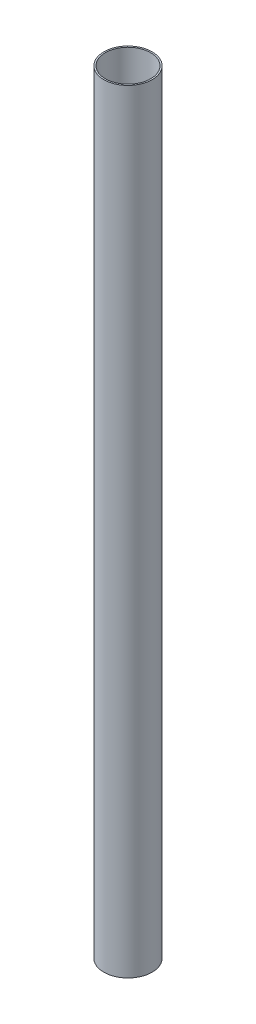
ISO-10303-21;
HEADER;
FILE_DESCRIPTION(('STEP AP214'),'2;1');
FILE_NAME('part.step','',(''),(''),'','','');
FILE_SCHEMA(('AUTOMOTIVE_DESIGN { 1 0 10303 214 1 1 1 1 }'));
ENDSEC;
DATA;
#1=APPLICATION_CONTEXT('core data for automotive mechanical design processes');
#2=APPLICATION_PROTOCOL_DEFINITION('international standard','automotive_design',2000,#1);
#3=PRODUCT_CONTEXT('',#1,'mechanical');
#4=PRODUCT('Part','Part','',(#3));
#5=PRODUCT_RELATED_PRODUCT_CATEGORY('part','',(#4));
#6=PRODUCT_DEFINITION_FORMATION('','',#4);
#7=PRODUCT_DEFINITION_CONTEXT('part definition',#1,'design');
#8=PRODUCT_DEFINITION('design','',#6,#7);
#9=PRODUCT_DEFINITION_SHAPE('','',#8);
#10=(LENGTH_UNIT() NAMED_UNIT(*) SI_UNIT(.MILLI.,.METRE.));
#11=(NAMED_UNIT(*) PLANE_ANGLE_UNIT() SI_UNIT($,.RADIAN.));
#12=(NAMED_UNIT(*) SI_UNIT($,.STERADIAN.) SOLID_ANGLE_UNIT());
#13=UNCERTAINTY_MEASURE_WITH_UNIT(LENGTH_MEASURE(1.E-05),#10,'distance_accuracy_value','');
#14=(GEOMETRIC_REPRESENTATION_CONTEXT(3) GLOBAL_UNCERTAINTY_ASSIGNED_CONTEXT((#13)) GLOBAL_UNIT_ASSIGNED_CONTEXT((#10,
#11,#12)) REPRESENTATION_CONTEXT('',''));
#15=CARTESIAN_POINT('',(0.,0.,0.));
#16=DIRECTION('',(0.,0.,1.));
#17=DIRECTION('',(1.,0.,0.));
#18=AXIS2_PLACEMENT_3D('',#15,#16,#17);
#19=CARTESIAN_POINT('',(0.,406.4,0.));
#20=DIRECTION('',(0.,-1.,0.));
#21=DIRECTION('',(0.,0.,-1.));
#22=AXIS2_PLACEMENT_3D('',#19,#20,#21);
#23=CYLINDRICAL_SURFACE('',#22,25.4);
#24=CARTESIAN_POINT('',(0.,406.4,0.));
#25=DIRECTION('',(0.,1.,0.));
#26=DIRECTION('',(0.,0.,1.));
#27=AXIS2_PLACEMENT_3D('',#24,#25,#26);
#28=CIRCLE('',#27,25.4);
#29=CARTESIAN_POINT('',(0.,406.4,25.4));
#30=VERTEX_POINT('',#29);
#31=EDGE_CURVE('E10',#30,#30,#28,.T.);
#32=ORIENTED_EDGE('',*,*,#31,.F.);
#33=EDGE_LOOP('',(#32));
#34=FACE_BOUND('',#33,.T.);
#35=CARTESIAN_POINT('',(0.,-406.4,0.));
#36=DIRECTION('',(0.,1.,0.));
#37=DIRECTION('',(0.,0.,1.));
#38=AXIS2_PLACEMENT_3D('',#35,#36,#37);
#39=CIRCLE('',#38,25.4);
#40=CARTESIAN_POINT('',(0.,-406.4,25.4));
#41=VERTEX_POINT('',#40);
#42=EDGE_CURVE('E40',#41,#41,#39,.T.);
#43=ORIENTED_EDGE('',*,*,#42,.T.);
#44=EDGE_LOOP('',(#43));
#45=FACE_BOUND('',#44,.T.);
#46=ADVANCED_FACE('F37',(#34,#45),#23,.T.);
#47=CARTESIAN_POINT('',(0.,406.4,0.));
#48=DIRECTION('',(0.,1.,0.));
#49=DIRECTION('',(0.,0.,1.));
#50=AXIS2_PLACEMENT_3D('',#47,#48,#49);
#51=PLANE('',#50);
#52=CARTESIAN_POINT('',(0.,406.4,0.));
#53=DIRECTION('',(0.,1.,0.));
#54=DIRECTION('',(0.,0.,1.));
#55=AXIS2_PLACEMENT_3D('',#52,#53,#54);
#56=CIRCLE('',#55,23.8125);
#57=CARTESIAN_POINT('',(0.,406.4,23.8125));
#58=VERTEX_POINT('',#57);
#59=EDGE_CURVE('E47',#58,#58,#56,.T.);
#60=ORIENTED_EDGE('',*,*,#59,.F.);
#61=EDGE_LOOP('',(#60));
#62=FACE_BOUND('',#61,.T.);
#63=ORIENTED_EDGE('',*,*,#31,.T.);
#64=EDGE_LOOP('',(#63));
#65=FACE_BOUND('',#64,.T.);
#66=ADVANCED_FACE('F58',(#62,#65),#51,.T.);
#67=CARTESIAN_POINT('',(0.,-406.4,0.));
#68=DIRECTION('',(0.,1.,0.));
#69=DIRECTION('',(0.,0.,1.));
#70=AXIS2_PLACEMENT_3D('',#67,#68,#69);
#71=PLANE('',#70);
#72=CARTESIAN_POINT('',(0.,-406.4,0.));
#73=DIRECTION('',(0.,1.,0.));
#74=DIRECTION('',(0.,0.,1.));
#75=AXIS2_PLACEMENT_3D('',#72,#73,#74);
#76=CIRCLE('',#75,23.8125);
#77=CARTESIAN_POINT('',(0.,-406.4,23.8125));
#78=VERTEX_POINT('',#77);
#79=EDGE_CURVE('E49',#78,#78,#76,.T.);
#80=ORIENTED_EDGE('',*,*,#79,.T.);
#81=EDGE_LOOP('',(#80));
#82=FACE_BOUND('',#81,.T.);
#83=ORIENTED_EDGE('',*,*,#42,.F.);
#84=EDGE_LOOP('',(#83));
#85=FACE_BOUND('',#84,.T.);
#86=ADVANCED_FACE('F60',(#82,#85),#71,.F.);
#87=CARTESIAN_POINT('',(0.,406.4,0.));
#88=DIRECTION('',(0.,-1.,0.));
#89=DIRECTION('',(0.,0.,-1.));
#90=AXIS2_PLACEMENT_3D('',#87,#88,#89);
#91=CYLINDRICAL_SURFACE('',#90,23.8125);
#92=ORIENTED_EDGE('',*,*,#59,.T.);
#93=EDGE_LOOP('',(#92));
#94=FACE_BOUND('',#93,.T.);
#95=ORIENTED_EDGE('',*,*,#79,.F.);
#96=EDGE_LOOP('',(#95));
#97=FACE_BOUND('',#96,.T.);
#98=ADVANCED_FACE('F55',(#94,#97),#91,.F.);
#99=CLOSED_SHELL('',(#46,#66,#86,#98));
#100=MANIFOLD_SOLID_BREP('B2',#99);
#101=ADVANCED_BREP_SHAPE_REPRESENTATION('',(#18,#100),#14);
#102=SHAPE_DEFINITION_REPRESENTATION(#9,#101);
ENDSEC;
END-ISO-10303-21;
